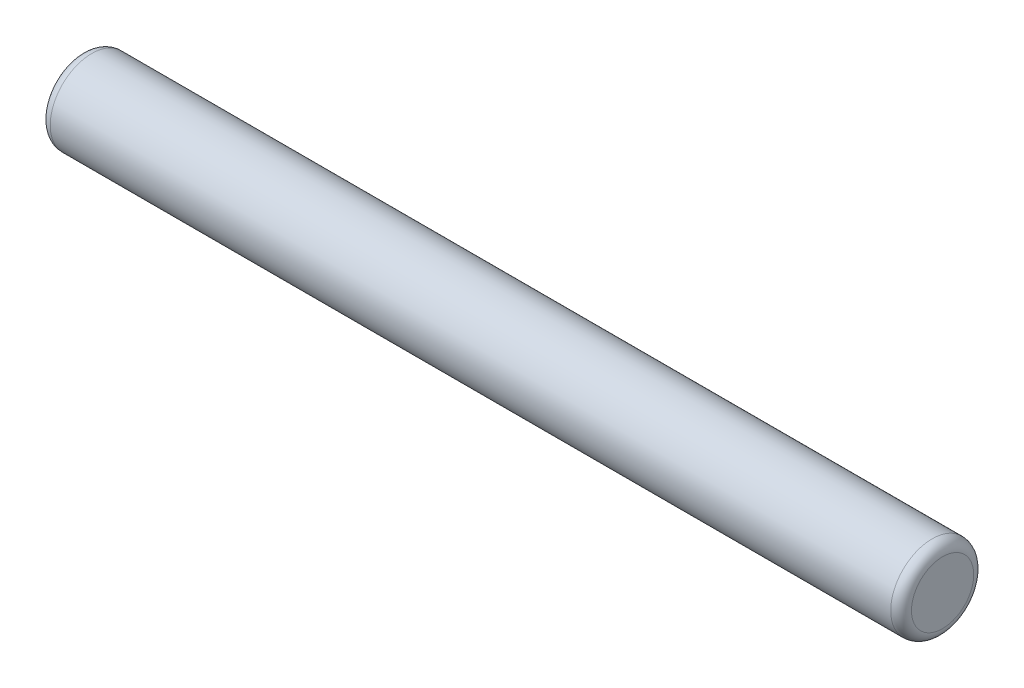
ISO-10303-21;
HEADER;
FILE_DESCRIPTION(('STEP AP214'),'2;1');
FILE_NAME('part.step','',(''),(''),'','','');
FILE_SCHEMA(('AUTOMOTIVE_DESIGN { 1 0 10303 214 1 1 1 1 }'));
ENDSEC;
DATA;
#1=APPLICATION_CONTEXT('core data for automotive mechanical design processes');
#2=APPLICATION_PROTOCOL_DEFINITION('international standard','automotive_design',2000,#1);
#3=PRODUCT_CONTEXT('',#1,'mechanical');
#4=PRODUCT('Part','Part','',(#3));
#5=PRODUCT_RELATED_PRODUCT_CATEGORY('part','',(#4));
#6=PRODUCT_DEFINITION_FORMATION('','',#4);
#7=PRODUCT_DEFINITION_CONTEXT('part definition',#1,'design');
#8=PRODUCT_DEFINITION('design','',#6,#7);
#9=PRODUCT_DEFINITION_SHAPE('','',#8);
#10=(LENGTH_UNIT() NAMED_UNIT(*) SI_UNIT(.MILLI.,.METRE.));
#11=(NAMED_UNIT(*) PLANE_ANGLE_UNIT() SI_UNIT($,.RADIAN.));
#12=(NAMED_UNIT(*) SI_UNIT($,.STERADIAN.) SOLID_ANGLE_UNIT());
#13=UNCERTAINTY_MEASURE_WITH_UNIT(LENGTH_MEASURE(1.E-05),#10,'distance_accuracy_value','');
#14=(GEOMETRIC_REPRESENTATION_CONTEXT(3) GLOBAL_UNCERTAINTY_ASSIGNED_CONTEXT((#13)) GLOBAL_UNIT_ASSIGNED_CONTEXT((#10,
#11,#12)) REPRESENTATION_CONTEXT('',''));
#15=CARTESIAN_POINT('',(0.,0.,0.));
#16=DIRECTION('',(0.,0.,1.));
#17=DIRECTION('',(1.,0.,0.));
#18=AXIS2_PLACEMENT_3D('',#15,#16,#17);
#19=CARTESIAN_POINT('',(83.,0.,0.));
#20=DIRECTION('',(-1.,0.,0.));
#21=DIRECTION('',(0.,0.,1.));
#22=AXIS2_PLACEMENT_3D('',#19,#20,#21);
#23=CYLINDRICAL_SURFACE('',#22,4.);
#24=CARTESIAN_POINT('',(82.,0.,0.));
#25=DIRECTION('',(1.,0.,0.));
#26=DIRECTION('',(0.,0.,-1.));
#27=AXIS2_PLACEMENT_3D('',#24,#25,#26);
#28=CIRCLE('',#27,4.);
#29=CARTESIAN_POINT('',(82.,0.,-4.));
#30=VERTEX_POINT('',#29);
#31=EDGE_CURVE('E38',#30,#30,#28,.F.);
#32=ORIENTED_EDGE('',*,*,#31,.T.);
#33=EDGE_LOOP('',(#32));
#34=FACE_BOUND('',#33,.T.);
#35=CARTESIAN_POINT('',(1.,0.,0.));
#36=DIRECTION('',(1.,0.,0.));
#37=DIRECTION('',(0.,0.,-1.));
#38=AXIS2_PLACEMENT_3D('',#35,#36,#37);
#39=CIRCLE('',#38,4.);
#40=CARTESIAN_POINT('',(1.,0.,-4.));
#41=VERTEX_POINT('',#40);
#42=EDGE_CURVE('E42',#41,#41,#39,.T.);
#43=ORIENTED_EDGE('',*,*,#42,.T.);
#44=EDGE_LOOP('',(#43));
#45=FACE_BOUND('',#44,.T.);
#46=ADVANCED_FACE('F31',(#34,#45),#23,.T.);
#47=CARTESIAN_POINT('',(83.,0.,0.));
#48=DIRECTION('',(1.,0.,0.));
#49=DIRECTION('',(0.,0.,-1.));
#50=AXIS2_PLACEMENT_3D('',#47,#48,#49);
#51=PLANE('',#50);
#52=CARTESIAN_POINT('',(83.,0.,0.));
#53=DIRECTION('',(1.,0.,0.));
#54=DIRECTION('',(0.,0.,-1.));
#55=AXIS2_PLACEMENT_3D('',#52,#53,#54);
#56=CIRCLE('',#55,3.);
#57=CARTESIAN_POINT('',(83.,0.,-3.));
#58=VERTEX_POINT('',#57);
#59=EDGE_CURVE('E46',#58,#58,#56,.T.);
#60=ORIENTED_EDGE('',*,*,#59,.T.);
#61=EDGE_LOOP('',(#60));
#62=FACE_BOUND('',#61,.T.);
#63=ADVANCED_FACE('F52',(#62),#51,.T.);
#64=CARTESIAN_POINT('',(0.,0.,0.));
#65=DIRECTION('',(1.,0.,0.));
#66=DIRECTION('',(0.,0.,-1.));
#67=AXIS2_PLACEMENT_3D('',#64,#65,#66);
#68=PLANE('',#67);
#69=CARTESIAN_POINT('',(0.,0.,0.));
#70=DIRECTION('',(1.,0.,0.));
#71=DIRECTION('',(0.,0.,-1.));
#72=AXIS2_PLACEMENT_3D('',#69,#70,#71);
#73=CIRCLE('',#72,3.);
#74=CARTESIAN_POINT('',(0.,0.,-3.));
#75=VERTEX_POINT('',#74);
#76=EDGE_CURVE('E10',#75,#75,#73,.F.);
#77=ORIENTED_EDGE('',*,*,#76,.T.);
#78=EDGE_LOOP('',(#77));
#79=FACE_BOUND('',#78,.T.);
#80=ADVANCED_FACE('F56',(#79),#68,.F.);
#81=CARTESIAN_POINT('',(82.,0.,0.));
#82=DIRECTION('',(1.,0.,0.));
#83=DIRECTION('',(0.,0.,-1.));
#84=AXIS2_PLACEMENT_3D('',#81,#82,#83);
#85=TOROIDAL_SURFACE('',#84,3.,1.);
#86=ORIENTED_EDGE('',*,*,#31,.F.);
#87=EDGE_LOOP('',(#86));
#88=FACE_BOUND('',#87,.T.);
#89=ORIENTED_EDGE('',*,*,#59,.F.);
#90=EDGE_LOOP('',(#89));
#91=FACE_BOUND('',#90,.T.);
#92=ADVANCED_FACE('F54',(#88,#91),#85,.T.);
#93=CARTESIAN_POINT('',(1.,0.,0.));
#94=DIRECTION('',(1.,0.,0.));
#95=DIRECTION('',(0.,0.,-1.));
#96=AXIS2_PLACEMENT_3D('',#93,#94,#95);
#97=TOROIDAL_SURFACE('',#96,3.,1.);
#98=ORIENTED_EDGE('',*,*,#76,.F.);
#99=EDGE_LOOP('',(#98));
#100=FACE_BOUND('',#99,.T.);
#101=ORIENTED_EDGE('',*,*,#42,.F.);
#102=EDGE_LOOP('',(#101));
#103=FACE_BOUND('',#102,.T.);
#104=ADVANCED_FACE('F33',(#100,#103),#97,.T.);
#105=CLOSED_SHELL('',(#46,#63,#80,#92,#104));
#106=MANIFOLD_SOLID_BREP('B2',#105);
#107=ADVANCED_BREP_SHAPE_REPRESENTATION('',(#18,#106),#14);
#108=SHAPE_DEFINITION_REPRESENTATION(#9,#107);
ENDSEC;
END-ISO-10303-21;
